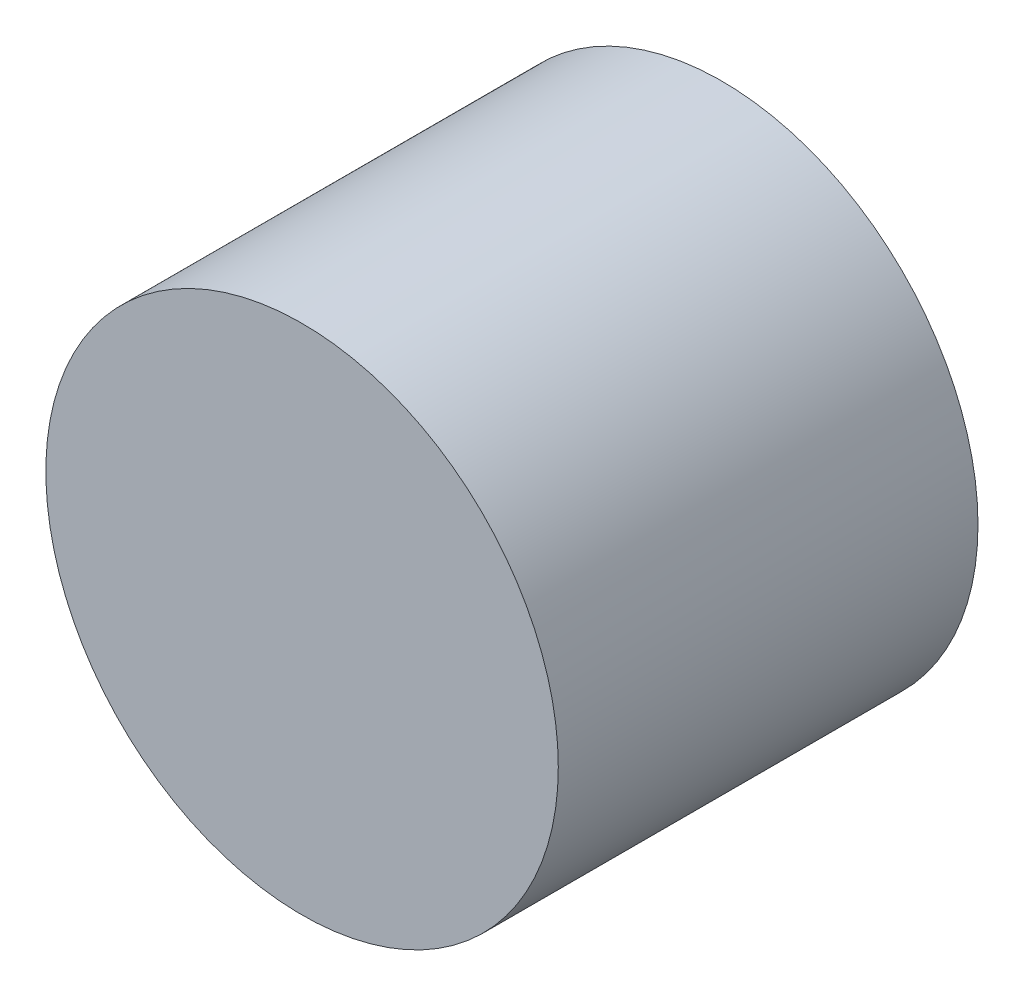
ISO-10303-21;
HEADER;
FILE_DESCRIPTION(('STEP AP214'),'2;1');
FILE_NAME('part.step','',(''),(''),'','','');
FILE_SCHEMA(('AUTOMOTIVE_DESIGN { 1 0 10303 214 1 1 1 1 }'));
ENDSEC;
DATA;
#1=APPLICATION_CONTEXT('core data for automotive mechanical design processes');
#2=APPLICATION_PROTOCOL_DEFINITION('international standard','automotive_design',2000,#1);
#3=PRODUCT_CONTEXT('',#1,'mechanical');
#4=PRODUCT('Part','Part','',(#3));
#5=PRODUCT_RELATED_PRODUCT_CATEGORY('part','',(#4));
#6=PRODUCT_DEFINITION_FORMATION('','',#4);
#7=PRODUCT_DEFINITION_CONTEXT('part definition',#1,'design');
#8=PRODUCT_DEFINITION('design','',#6,#7);
#9=PRODUCT_DEFINITION_SHAPE('','',#8);
#10=(LENGTH_UNIT() NAMED_UNIT(*) SI_UNIT(.MILLI.,.METRE.));
#11=(NAMED_UNIT(*) PLANE_ANGLE_UNIT() SI_UNIT($,.RADIAN.));
#12=(NAMED_UNIT(*) SI_UNIT($,.STERADIAN.) SOLID_ANGLE_UNIT());
#13=UNCERTAINTY_MEASURE_WITH_UNIT(LENGTH_MEASURE(1.E-05),#10,'distance_accuracy_value','');
#14=(GEOMETRIC_REPRESENTATION_CONTEXT(3) GLOBAL_UNCERTAINTY_ASSIGNED_CONTEXT((#13)) GLOBAL_UNIT_ASSIGNED_CONTEXT((#10,
#11,#12)) REPRESENTATION_CONTEXT('',''));
#15=CARTESIAN_POINT('',(0.,0.,0.));
#16=DIRECTION('',(0.,0.,1.));
#17=DIRECTION('',(1.,0.,0.));
#18=AXIS2_PLACEMENT_3D('',#15,#16,#17);
#19=CARTESIAN_POINT('',(6.787,-3.953,14.42408));
#20=DIRECTION('',(0.,0.,-1.));
#21=DIRECTION('',(-1.,0.,0.));
#22=AXIS2_PLACEMENT_3D('',#19,#20,#21);
#23=CYLINDRICAL_SURFACE('',#22,8.80613);
#24=CARTESIAN_POINT('',(6.787,-3.953,14.42408));
#25=DIRECTION('',(0.,0.,1.));
#26=DIRECTION('',(1.,0.,0.));
#27=AXIS2_PLACEMENT_3D('',#24,#25,#26);
#28=CIRCLE('',#27,8.80613);
#29=CARTESIAN_POINT('',(15.59313,-3.953,14.42408));
#30=VERTEX_POINT('',#29);
#31=EDGE_CURVE('E10',#30,#30,#28,.T.);
#32=ORIENTED_EDGE('',*,*,#31,.F.);
#33=EDGE_LOOP('',(#32));
#34=FACE_BOUND('',#33,.T.);
#35=CARTESIAN_POINT('',(6.787,-3.953,0.));
#36=DIRECTION('',(0.,0.,1.));
#37=DIRECTION('',(1.,0.,0.));
#38=AXIS2_PLACEMENT_3D('',#35,#36,#37);
#39=CIRCLE('',#38,8.80613);
#40=CARTESIAN_POINT('',(15.59313,-3.953,0.));
#41=VERTEX_POINT('',#40);
#42=EDGE_CURVE('E45',#41,#41,#39,.T.);
#43=ORIENTED_EDGE('',*,*,#42,.T.);
#44=EDGE_LOOP('',(#43));
#45=FACE_BOUND('',#44,.T.);
#46=ADVANCED_FACE('F39',(#34,#45),#23,.T.);
#47=CARTESIAN_POINT('',(6.787,-3.953,14.42408));
#48=DIRECTION('',(0.,0.,1.));
#49=DIRECTION('',(1.,0.,0.));
#50=AXIS2_PLACEMENT_3D('',#47,#48,#49);
#51=PLANE('',#50);
#52=ORIENTED_EDGE('',*,*,#31,.T.);
#53=EDGE_LOOP('',(#52));
#54=FACE_BOUND('',#53,.T.);
#55=ADVANCED_FACE('F53',(#54),#51,.T.);
#56=CARTESIAN_POINT('',(6.787,-3.953,0.));
#57=DIRECTION('',(0.,0.,1.));
#58=DIRECTION('',(1.,0.,0.));
#59=AXIS2_PLACEMENT_3D('',#56,#57,#58);
#60=PLANE('',#59);
#61=ORIENTED_EDGE('',*,*,#42,.F.);
#62=EDGE_LOOP('',(#61));
#63=FACE_BOUND('',#62,.T.);
#64=ADVANCED_FACE('F55',(#63),#60,.F.);
#65=CLOSED_SHELL('',(#46,#55,#64));
#66=MANIFOLD_SOLID_BREP('B2',#65);
#67=ADVANCED_BREP_SHAPE_REPRESENTATION('',(#18,#66),#14);
#68=SHAPE_DEFINITION_REPRESENTATION(#9,#67);
ENDSEC;
END-ISO-10303-21;
